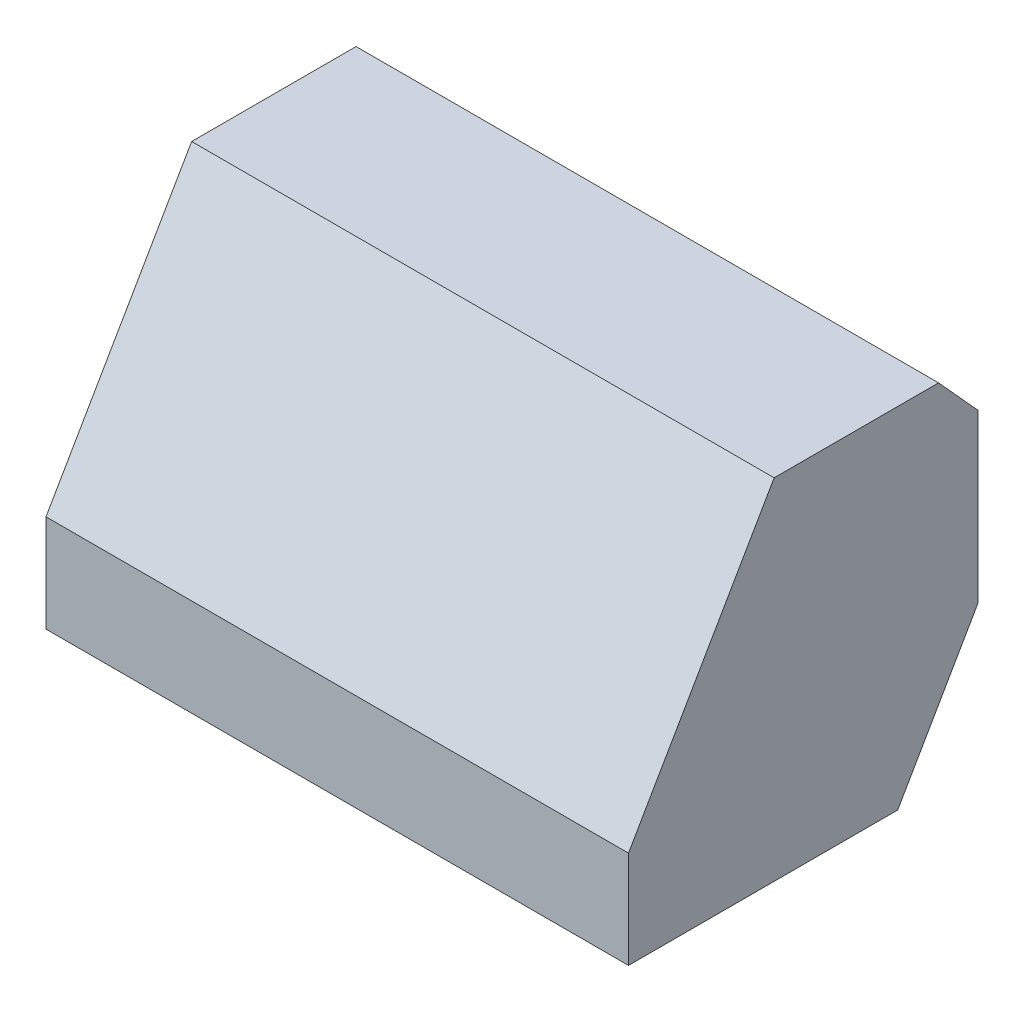
ISO-10303-21;
HEADER;
FILE_DESCRIPTION(('STEP AP214'),'2;1');
FILE_NAME('part.step','',(''),(''),'','','');
FILE_SCHEMA(('AUTOMOTIVE_DESIGN { 1 0 10303 214 1 1 1 1 }'));
ENDSEC;
DATA;
#1=APPLICATION_CONTEXT('core data for automotive mechanical design processes');
#2=APPLICATION_PROTOCOL_DEFINITION('international standard','automotive_design',2000,#1);
#3=PRODUCT_CONTEXT('',#1,'mechanical');
#4=PRODUCT('Part','Part','',(#3));
#5=PRODUCT_RELATED_PRODUCT_CATEGORY('part','',(#4));
#6=PRODUCT_DEFINITION_FORMATION('','',#4);
#7=PRODUCT_DEFINITION_CONTEXT('part definition',#1,'design');
#8=PRODUCT_DEFINITION('design','',#6,#7);
#9=PRODUCT_DEFINITION_SHAPE('','',#8);
#10=(LENGTH_UNIT() NAMED_UNIT(*) SI_UNIT(.MILLI.,.METRE.));
#11=(NAMED_UNIT(*) PLANE_ANGLE_UNIT() SI_UNIT($,.RADIAN.));
#12=(NAMED_UNIT(*) SI_UNIT($,.STERADIAN.) SOLID_ANGLE_UNIT());
#13=UNCERTAINTY_MEASURE_WITH_UNIT(LENGTH_MEASURE(1.E-05),#10,'distance_accuracy_value','');
#14=(GEOMETRIC_REPRESENTATION_CONTEXT(3) GLOBAL_UNCERTAINTY_ASSIGNED_CONTEXT((#13)) GLOBAL_UNIT_ASSIGNED_CONTEXT((#10,
#11,#12)) REPRESENTATION_CONTEXT('',''));
#15=CARTESIAN_POINT('',(0.,0.,0.));
#16=DIRECTION('',(0.,0.,1.));
#17=DIRECTION('',(1.,0.,0.));
#18=AXIS2_PLACEMENT_3D('',#15,#16,#17);
#19=CARTESIAN_POINT('',(50.,60.,-30.));
#20=DIRECTION('',(-1.,0.,0.));
#21=DIRECTION('',(0.,0.,1.));
#22=AXIS2_PLACEMENT_3D('',#19,#20,#21);
#23=PLANE('',#22);
#24=DIRECTION('',(0.,0.,-1.));
#25=VECTOR('',#24,1.);
#26=CARTESIAN_POINT('',(50.,60.,-30.));
#27=LINE('',#26,#25);
#28=CARTESIAN_POINT('',(50.,60.,5.0000000000001));
#29=VERTEX_POINT('',#28);
#30=CARTESIAN_POINT('',(50.,60.,-23.2327245706756));
#31=VERTEX_POINT('',#30);
#32=EDGE_CURVE('E105',#29,#31,#27,.T.);
#33=ORIENTED_EDGE('',*,*,#32,.F.);
#34=DIRECTION('',(0.,0.86602540378444,-0.499999999999998));
#35=VECTOR('',#34,1.);
#36=CARTESIAN_POINT('',(50.,16.698729810778,30.));
#37=LINE('',#36,#35);
#38=CARTESIAN_POINT('',(50.,16.698729810778,30.));
#39=VERTEX_POINT('',#38);
#40=EDGE_CURVE('E55',#39,#29,#37,.T.);
#41=ORIENTED_EDGE('',*,*,#40,.F.);
#42=DIRECTION('',(0.,-1.,0.));
#43=VECTOR('',#42,1.);
#44=CARTESIAN_POINT('',(50.,60.,30.));
#45=LINE('',#44,#43);
#46=CARTESIAN_POINT('',(50.,0.,30.));
#47=VERTEX_POINT('',#46);
#48=EDGE_CURVE('E101',#39,#47,#45,.T.);
#49=ORIENTED_EDGE('',*,*,#48,.T.);
#50=DIRECTION('',(0.,0.,-1.));
#51=VECTOR('',#50,1.);
#52=CARTESIAN_POINT('',(50.,0.,-30.));
#53=LINE('',#52,#51);
#54=CARTESIAN_POINT('',(50.,0.,-16.2165976493289));
#55=VERTEX_POINT('',#54);
#56=EDGE_CURVE('E151',#47,#55,#53,.T.);
#57=ORIENTED_EDGE('',*,*,#56,.T.);
#58=DIRECTION('',(0.,-0.86602540378444,0.499999999999998));
#59=VECTOR('',#58,1.);
#60=CARTESIAN_POINT('',(50.,23.8735531725267,-30.));
#61=LINE('',#60,#59);
#62=CARTESIAN_POINT('',(50.,23.8735531725267,-30.));
#63=VERTEX_POINT('',#62);
#64=EDGE_CURVE('E138',#63,#55,#61,.T.);
#65=ORIENTED_EDGE('',*,*,#64,.F.);
#66=DIRECTION('',(0.,-1.,0.));
#67=VECTOR('',#66,1.);
#68=CARTESIAN_POINT('',(50.,60.,-30.));
#69=LINE('',#68,#67);
#70=CARTESIAN_POINT('',(50.,52.5406186328929,-30.));
#71=VERTEX_POINT('',#70);
#72=EDGE_CURVE('E11',#71,#63,#69,.T.);
#73=ORIENTED_EDGE('',*,*,#72,.F.);
#74=DIRECTION('',(0.,-0.740630586875886,-0.67191244502828));
#75=VECTOR('',#74,1.);
#76=CARTESIAN_POINT('',(50.,52.5406186328929,-30.));
#77=LINE('',#76,#75);
#78=EDGE_CURVE('E146',#31,#71,#77,.T.);
#79=ORIENTED_EDGE('',*,*,#78,.F.);
#80=EDGE_LOOP('',(#33,#41,#49,#57,#65,#73,#79));
#81=FACE_BOUND('',#80,.T.);
#82=ADVANCED_FACE('F33',(#81),#23,.F.);
#83=CARTESIAN_POINT('',(-50.,60.,-30.));
#84=DIRECTION('',(0.,0.,1.));
#85=DIRECTION('',(1.,0.,0.));
#86=AXIS2_PLACEMENT_3D('',#83,#84,#85);
#87=PLANE('',#86);
#88=ORIENTED_EDGE('',*,*,#72,.T.);
#89=DIRECTION('',(1.,0.,0.));
#90=VECTOR('',#89,1.);
#91=CARTESIAN_POINT('',(-100.,23.8735531725267,-30.));
#92=LINE('',#91,#90);
#93=CARTESIAN_POINT('',(-50.,23.8735531725267,-30.));
#94=VERTEX_POINT('',#93);
#95=EDGE_CURVE('E134',#94,#63,#92,.T.);
#96=ORIENTED_EDGE('',*,*,#95,.F.);
#97=DIRECTION('',(0.,-1.,0.));
#98=VECTOR('',#97,1.);
#99=CARTESIAN_POINT('',(-50.,60.,-30.));
#100=LINE('',#99,#98);
#101=CARTESIAN_POINT('',(-50.,52.5406186328929,-30.));
#102=VERTEX_POINT('',#101);
#103=EDGE_CURVE('E40',#102,#94,#100,.T.);
#104=ORIENTED_EDGE('',*,*,#103,.F.);
#105=DIRECTION('',(1.,0.,0.));
#106=VECTOR('',#105,1.);
#107=CARTESIAN_POINT('',(-100.,52.5406186328929,-30.));
#108=LINE('',#107,#106);
#109=EDGE_CURVE('E132',#102,#71,#108,.T.);
#110=ORIENTED_EDGE('',*,*,#109,.T.);
#111=EDGE_LOOP('',(#88,#96,#104,#110));
#112=FACE_BOUND('',#111,.T.);
#113=ADVANCED_FACE('F131',(#112),#87,.F.);
#114=CARTESIAN_POINT('',(-50.,60.,-30.));
#115=DIRECTION('',(1.,0.,0.));
#116=DIRECTION('',(0.,0.,-1.));
#117=AXIS2_PLACEMENT_3D('',#114,#115,#116);
#118=PLANE('',#117);
#119=DIRECTION('',(0.,-1.,0.));
#120=VECTOR('',#119,1.);
#121=CARTESIAN_POINT('',(-50.,60.,30.));
#122=LINE('',#121,#120);
#123=CARTESIAN_POINT('',(-50.,16.698729810778,30.));
#124=VERTEX_POINT('',#123);
#125=CARTESIAN_POINT('',(-50.,0.,30.));
#126=VERTEX_POINT('',#125);
#127=EDGE_CURVE('E112',#124,#126,#122,.T.);
#128=ORIENTED_EDGE('',*,*,#127,.F.);
#129=DIRECTION('',(0.,-0.86602540378444,0.499999999999998));
#130=VECTOR('',#129,1.);
#131=CARTESIAN_POINT('',(-50.,16.698729810778,30.));
#132=LINE('',#131,#130);
#133=CARTESIAN_POINT('',(-50.,60.,5.00000000000014));
#134=VERTEX_POINT('',#133);
#135=EDGE_CURVE('E92',#134,#124,#132,.T.);
#136=ORIENTED_EDGE('',*,*,#135,.F.);
#137=DIRECTION('',(0.,0.,1.));
#138=VECTOR('',#137,1.);
#139=CARTESIAN_POINT('',(-50.,60.,-30.));
#140=LINE('',#139,#138);
#141=CARTESIAN_POINT('',(-50.,60.,-23.2327245706756));
#142=VERTEX_POINT('',#141);
#143=EDGE_CURVE('E113',#142,#134,#140,.T.);
#144=ORIENTED_EDGE('',*,*,#143,.F.);
#145=DIRECTION('',(0.,0.740630586875886,0.67191244502828));
#146=VECTOR('',#145,1.);
#147=CARTESIAN_POINT('',(-50.,52.540618632893,-30.));
#148=LINE('',#147,#146);
#149=EDGE_CURVE('E47',#102,#142,#148,.T.);
#150=ORIENTED_EDGE('',*,*,#149,.F.);
#151=ORIENTED_EDGE('',*,*,#103,.T.);
#152=DIRECTION('',(0.,0.86602540378444,-0.499999999999998));
#153=VECTOR('',#152,1.);
#154=CARTESIAN_POINT('',(-50.,23.8735531725267,-30.));
#155=LINE('',#154,#153);
#156=CARTESIAN_POINT('',(-50.,0.,-16.2165976493289));
#157=VERTEX_POINT('',#156);
#158=EDGE_CURVE('E106',#157,#94,#155,.T.);
#159=ORIENTED_EDGE('',*,*,#158,.F.);
#160=DIRECTION('',(0.,0.,1.));
#161=VECTOR('',#160,1.);
#162=CARTESIAN_POINT('',(-50.,0.,-30.));
#163=LINE('',#162,#161);
#164=EDGE_CURVE('E152',#157,#126,#163,.T.);
#165=ORIENTED_EDGE('',*,*,#164,.T.);
#166=EDGE_LOOP('',(#128,#136,#144,#150,#151,#159,#165));
#167=FACE_BOUND('',#166,.T.);
#168=ADVANCED_FACE('F124',(#167),#118,.F.);
#169=CARTESIAN_POINT('',(-50.,60.,30.));
#170=DIRECTION('',(0.,0.,-1.));
#171=DIRECTION('',(-1.,0.,0.));
#172=AXIS2_PLACEMENT_3D('',#169,#170,#171);
#173=PLANE('',#172);
#174=ORIENTED_EDGE('',*,*,#48,.F.);
#175=DIRECTION('',(1.,0.,0.));
#176=VECTOR('',#175,1.);
#177=CARTESIAN_POINT('',(-100.,16.698729810778,30.));
#178=LINE('',#177,#176);
#179=EDGE_CURVE('E89',#124,#39,#178,.T.);
#180=ORIENTED_EDGE('',*,*,#179,.F.);
#181=ORIENTED_EDGE('',*,*,#127,.T.);
#182=DIRECTION('',(1.,0.,0.));
#183=VECTOR('',#182,1.);
#184=CARTESIAN_POINT('',(-50.,0.,30.));
#185=LINE('',#184,#183);
#186=EDGE_CURVE('E110',#126,#47,#185,.T.);
#187=ORIENTED_EDGE('',*,*,#186,.T.);
#188=EDGE_LOOP('',(#174,#180,#181,#187));
#189=FACE_BOUND('',#188,.T.);
#190=ADVANCED_FACE('F108',(#189),#173,.F.);
#191=CARTESIAN_POINT('',(0.,60.,0.));
#192=DIRECTION('',(0.,1.,0.));
#193=DIRECTION('',(0.,0.,1.));
#194=AXIS2_PLACEMENT_3D('',#191,#192,#193);
#195=PLANE('',#194);
#196=DIRECTION('',(1.,0.,0.));
#197=VECTOR('',#196,1.);
#198=CARTESIAN_POINT('',(-100.,60.,5.00000000000015));
#199=LINE('',#198,#197);
#200=EDGE_CURVE('E96',#134,#29,#199,.T.);
#201=ORIENTED_EDGE('',*,*,#200,.T.);
#202=ORIENTED_EDGE('',*,*,#32,.T.);
#203=DIRECTION('',(1.,0.,0.));
#204=VECTOR('',#203,1.);
#205=CARTESIAN_POINT('',(-100.,60.,-23.2327245706756));
#206=LINE('',#205,#204);
#207=EDGE_CURVE('E145',#142,#31,#206,.T.);
#208=ORIENTED_EDGE('',*,*,#207,.F.);
#209=ORIENTED_EDGE('',*,*,#143,.T.);
#210=EDGE_LOOP('',(#201,#202,#208,#209));
#211=FACE_BOUND('',#210,.T.);
#212=ADVANCED_FACE('F160',(#211),#195,.T.);
#213=CARTESIAN_POINT('',(0.,0.,0.));
#214=DIRECTION('',(0.,1.,0.));
#215=DIRECTION('',(0.,0.,1.));
#216=AXIS2_PLACEMENT_3D('',#213,#214,#215);
#217=PLANE('',#216);
#218=ORIENTED_EDGE('',*,*,#164,.F.);
#219=DIRECTION('',(1.,0.,0.));
#220=VECTOR('',#219,1.);
#221=CARTESIAN_POINT('',(-100.,0.,-16.2165976493289));
#222=LINE('',#221,#220);
#223=EDGE_CURVE('E137',#157,#55,#222,.T.);
#224=ORIENTED_EDGE('',*,*,#223,.T.);
#225=ORIENTED_EDGE('',*,*,#56,.F.);
#226=ORIENTED_EDGE('',*,*,#186,.F.);
#227=EDGE_LOOP('',(#218,#224,#225,#226));
#228=FACE_BOUND('',#227,.T.);
#229=ADVANCED_FACE('F154',(#228),#217,.F.);
#230=CARTESIAN_POINT('',(-100.,23.8735531725267,-30.));
#231=DIRECTION('',(0.,0.499999999999998,0.86602540378444));
#232=DIRECTION('',(0.,-0.86602540378444,0.499999999999998));
#233=AXIS2_PLACEMENT_3D('',#230,#231,#232);
#234=PLANE('',#233);
#235=ORIENTED_EDGE('',*,*,#158,.T.);
#236=ORIENTED_EDGE('',*,*,#95,.T.);
#237=ORIENTED_EDGE('',*,*,#64,.T.);
#238=ORIENTED_EDGE('',*,*,#223,.F.);
#239=EDGE_LOOP('',(#235,#236,#237,#238));
#240=FACE_BOUND('',#239,.T.);
#241=ADVANCED_FACE('F155',(#240),#234,.F.);
#242=CARTESIAN_POINT('',(-100.,52.5406186328929,-30.));
#243=DIRECTION('',(0.,-0.67191244502828,0.740630586875886));
#244=DIRECTION('',(0.,-0.740630586875886,-0.67191244502828));
#245=AXIS2_PLACEMENT_3D('',#242,#243,#244);
#246=PLANE('',#245);
#247=ORIENTED_EDGE('',*,*,#149,.T.);
#248=ORIENTED_EDGE('',*,*,#207,.T.);
#249=ORIENTED_EDGE('',*,*,#78,.T.);
#250=ORIENTED_EDGE('',*,*,#109,.F.);
#251=EDGE_LOOP('',(#247,#248,#249,#250));
#252=FACE_BOUND('',#251,.T.);
#253=ADVANCED_FACE('F161',(#252),#246,.F.);
#254=CARTESIAN_POINT('',(-100.,16.698729810778,30.));
#255=DIRECTION('',(0.,-0.499999999999998,-0.86602540378444));
#256=DIRECTION('',(0.,0.86602540378444,-0.499999999999998));
#257=AXIS2_PLACEMENT_3D('',#254,#255,#256);
#258=PLANE('',#257);
#259=ORIENTED_EDGE('',*,*,#135,.T.);
#260=ORIENTED_EDGE('',*,*,#179,.T.);
#261=ORIENTED_EDGE('',*,*,#40,.T.);
#262=ORIENTED_EDGE('',*,*,#200,.F.);
#263=EDGE_LOOP('',(#259,#260,#261,#262));
#264=FACE_BOUND('',#263,.T.);
#265=ADVANCED_FACE('F90',(#264),#258,.F.);
#266=CLOSED_SHELL('',(#82,#113,#168,#190,#212,#229,#241,#253,#265));
#267=MANIFOLD_SOLID_BREP('B2',#266);
#268=ADVANCED_BREP_SHAPE_REPRESENTATION('',(#18,#267),#14);
#269=SHAPE_DEFINITION_REPRESENTATION(#9,#268);
ENDSEC;
END-ISO-10303-21;
